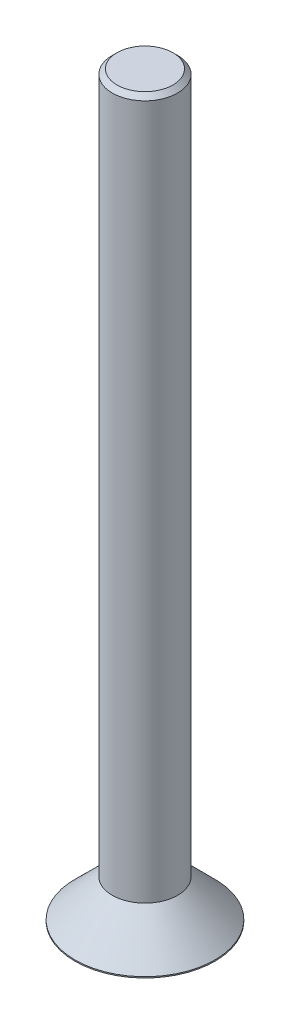
ISO-10303-21;
HEADER;
FILE_DESCRIPTION(('STEP AP214'),'2;1');
FILE_NAME('part.step','',(''),(''),'','','');
FILE_SCHEMA(('AUTOMOTIVE_DESIGN { 1 0 10303 214 1 1 1 1 }'));
ENDSEC;
DATA;
#1=APPLICATION_CONTEXT('core data for automotive mechanical design processes');
#2=APPLICATION_PROTOCOL_DEFINITION('international standard','automotive_design',2000,#1);
#3=PRODUCT_CONTEXT('',#1,'mechanical');
#4=PRODUCT('Part','Part','',(#3));
#5=PRODUCT_RELATED_PRODUCT_CATEGORY('part','',(#4));
#6=PRODUCT_DEFINITION_FORMATION('','',#4);
#7=PRODUCT_DEFINITION_CONTEXT('part definition',#1,'design');
#8=PRODUCT_DEFINITION('design','',#6,#7);
#9=PRODUCT_DEFINITION_SHAPE('','',#8);
#10=(LENGTH_UNIT() NAMED_UNIT(*) SI_UNIT(.MILLI.,.METRE.));
#11=(NAMED_UNIT(*) PLANE_ANGLE_UNIT() SI_UNIT($,.RADIAN.));
#12=(NAMED_UNIT(*) SI_UNIT($,.STERADIAN.) SOLID_ANGLE_UNIT());
#13=UNCERTAINTY_MEASURE_WITH_UNIT(LENGTH_MEASURE(1.E-05),#10,'distance_accuracy_value','');
#14=(GEOMETRIC_REPRESENTATION_CONTEXT(3) GLOBAL_UNCERTAINTY_ASSIGNED_CONTEXT((#13)) GLOBAL_UNIT_ASSIGNED_CONTEXT((#10,
#11,#12)) REPRESENTATION_CONTEXT('',''));
#15=CARTESIAN_POINT('',(0.,0.,0.));
#16=DIRECTION('',(0.,0.,1.));
#17=DIRECTION('',(1.,0.,0.));
#18=AXIS2_PLACEMENT_3D('',#15,#16,#17);
#19=CARTESIAN_POINT('',(0.,1.65,0.));
#20=DIRECTION('',(0.,-1.,0.));
#21=DIRECTION('',(0.,0.,-1.));
#22=AXIS2_PLACEMENT_3D('',#19,#20,#21);
#23=CYLINDRICAL_SURFACE('',#22,3.);
#24=CARTESIAN_POINT('',(0.,0.0499999999999921,0.));
#25=DIRECTION('',(0.,1.,0.));
#26=DIRECTION('',(0.,0.,1.));
#27=AXIS2_PLACEMENT_3D('',#24,#25,#26);
#28=CIRCLE('',#27,3.);
#29=CARTESIAN_POINT('',(0.,0.0499999999999921,3.));
#30=VERTEX_POINT('',#29);
#31=EDGE_CURVE('E151',#30,#30,#28,.F.);
#32=ORIENTED_EDGE('',*,*,#31,.T.);
#33=EDGE_LOOP('',(#32));
#34=FACE_BOUND('',#33,.T.);
#35=CARTESIAN_POINT('',(0.,0.,0.));
#36=DIRECTION('',(0.,1.,0.));
#37=DIRECTION('',(0.,0.,1.));
#38=AXIS2_PLACEMENT_3D('',#35,#36,#37);
#39=CIRCLE('',#38,3.);
#40=CARTESIAN_POINT('',(0.,0.,3.));
#41=VERTEX_POINT('',#40);
#42=EDGE_CURVE('E140',#41,#41,#39,.T.);
#43=ORIENTED_EDGE('',*,*,#42,.T.);
#44=EDGE_LOOP('',(#43));
#45=FACE_BOUND('',#44,.T.);
#46=ADVANCED_FACE('F37',(#34,#45),#23,.T.);
#47=CARTESIAN_POINT('',(0.,0.,0.));
#48=DIRECTION('',(0.,1.,0.));
#49=DIRECTION('',(0.,0.,1.));
#50=AXIS2_PLACEMENT_3D('',#47,#48,#49);
#51=PLANE('',#50);
#52=DIRECTION('',(0.,0.,1.));
#53=VECTOR('',#52,1.);
#54=CARTESIAN_POINT('',(1.,0.,-0.577350269189627));
#55=LINE('',#54,#53);
#56=CARTESIAN_POINT('',(1.,0.,-0.577350269189627));
#57=VERTEX_POINT('',#56);
#58=CARTESIAN_POINT('',(1.,0.,0.577350269189626));
#59=VERTEX_POINT('',#58);
#60=EDGE_CURVE('E127',#57,#59,#55,.T.);
#61=ORIENTED_EDGE('',*,*,#60,.F.);
#62=DIRECTION('',(0.866025403784439,0.,0.5));
#63=VECTOR('',#62,1.);
#64=CARTESIAN_POINT('',(0.,0.,-1.15470053837925));
#65=LINE('',#64,#63);
#66=CARTESIAN_POINT('',(0.,0.,-1.15470053837925));
#67=VERTEX_POINT('',#66);
#68=EDGE_CURVE('E53',#67,#57,#65,.T.);
#69=ORIENTED_EDGE('',*,*,#68,.F.);
#70=DIRECTION('',(0.866025403784439,0.,-0.5));
#71=VECTOR('',#70,1.);
#72=CARTESIAN_POINT('',(-1.,0.,-0.577350269189626));
#73=LINE('',#72,#71);
#74=CARTESIAN_POINT('',(-1.,0.,-0.577350269189626));
#75=VERTEX_POINT('',#74);
#76=EDGE_CURVE('E136',#75,#67,#73,.T.);
#77=ORIENTED_EDGE('',*,*,#76,.F.);
#78=DIRECTION('',(0.,0.,-1.));
#79=VECTOR('',#78,1.);
#80=CARTESIAN_POINT('',(-1.,0.,0.577350269189626));
#81=LINE('',#80,#79);
#82=CARTESIAN_POINT('',(-1.,0.,0.577350269189626));
#83=VERTEX_POINT('',#82);
#84=EDGE_CURVE('E134',#83,#75,#81,.T.);
#85=ORIENTED_EDGE('',*,*,#84,.F.);
#86=DIRECTION('',(-0.866025403784439,0.,-0.5));
#87=VECTOR('',#86,1.);
#88=CARTESIAN_POINT('',(0.,0.,1.15470053837925));
#89=LINE('',#88,#87);
#90=CARTESIAN_POINT('',(0.,0.,1.15470053837925));
#91=VERTEX_POINT('',#90);
#92=EDGE_CURVE('E101',#91,#83,#89,.T.);
#93=ORIENTED_EDGE('',*,*,#92,.F.);
#94=DIRECTION('',(-0.866025403784439,0.,0.5));
#95=VECTOR('',#94,1.);
#96=CARTESIAN_POINT('',(1.,0.,0.577350269189626));
#97=LINE('',#96,#95);
#98=EDGE_CURVE('E130',#59,#91,#97,.T.);
#99=ORIENTED_EDGE('',*,*,#98,.F.);
#100=EDGE_LOOP('',(#61,#69,#77,#85,#93,#99));
#101=FACE_BOUND('',#100,.T.);
#102=ORIENTED_EDGE('',*,*,#42,.F.);
#103=EDGE_LOOP('',(#102));
#104=FACE_BOUND('',#103,.T.);
#105=ADVANCED_FACE('F167',(#101,#104),#51,.F.);
#106=CARTESIAN_POINT('',(0.,1.65,0.));
#107=DIRECTION('',(0.,-1.,0.));
#108=DIRECTION('',(0.,0.,-1.));
#109=AXIS2_PLACEMENT_3D('',#106,#107,#108);
#110=CONICAL_SURFACE('',#109,1.4,0.785398163397447);
#111=ORIENTED_EDGE('',*,*,#31,.F.);
#112=EDGE_LOOP('',(#111));
#113=FACE_BOUND('',#112,.T.);
#114=CARTESIAN_POINT('',(0.,1.65,0.));
#115=DIRECTION('',(0.,1.,0.));
#116=DIRECTION('',(0.,0.,1.));
#117=AXIS2_PLACEMENT_3D('',#114,#115,#116);
#118=CIRCLE('',#117,1.4);
#119=CARTESIAN_POINT('',(0.,1.65,1.4));
#120=VERTEX_POINT('',#119);
#121=EDGE_CURVE('E148',#120,#120,#118,.T.);
#122=ORIENTED_EDGE('',*,*,#121,.F.);
#123=EDGE_LOOP('',(#122));
#124=FACE_BOUND('',#123,.T.);
#125=ADVANCED_FACE('F173',(#113,#124),#110,.T.);
#126=CARTESIAN_POINT('',(0.,0.95,-1.15470053837925));
#127=DIRECTION('',(0.5,0.,-0.866025403784439));
#128=DIRECTION('',(-0.866025403784439,0.,-0.5));
#129=AXIS2_PLACEMENT_3D('',#126,#127,#128);
#130=PLANE('',#129);
#131=ORIENTED_EDGE('',*,*,#68,.T.);
#132=DIRECTION('',(0.,-1.,0.));
#133=VECTOR('',#132,1.);
#134=CARTESIAN_POINT('',(1.,0.95,-0.577350269189627));
#135=LINE('',#134,#133);
#136=CARTESIAN_POINT('',(1.,0.95,-0.577350269189627));
#137=VERTEX_POINT('',#136);
#138=EDGE_CURVE('E83',#137,#57,#135,.T.);
#139=ORIENTED_EDGE('',*,*,#138,.F.);
#140=DIRECTION('',(0.866025403784439,0.,0.5));
#141=VECTOR('',#140,1.);
#142=CARTESIAN_POINT('',(0.,0.95,-1.15470053837925));
#143=LINE('',#142,#141);
#144=CARTESIAN_POINT('',(0.,0.95,-1.15470053837925));
#145=VERTEX_POINT('',#144);
#146=EDGE_CURVE('E138',#145,#137,#143,.T.);
#147=ORIENTED_EDGE('',*,*,#146,.F.);
#148=DIRECTION('',(0.,-1.,0.));
#149=VECTOR('',#148,1.);
#150=CARTESIAN_POINT('',(0.,0.95,-1.15470053837925));
#151=LINE('',#150,#149);
#152=EDGE_CURVE('E61',#145,#67,#151,.T.);
#153=ORIENTED_EDGE('',*,*,#152,.T.);
#154=EDGE_LOOP('',(#131,#139,#147,#153));
#155=FACE_BOUND('',#154,.T.);
#156=ADVANCED_FACE('F182',(#155),#130,.F.);
#157=CARTESIAN_POINT('',(-1.,0.95,-0.577350269189626));
#158=DIRECTION('',(-0.5,0.,-0.866025403784439));
#159=DIRECTION('',(-0.866025403784439,0.,0.5));
#160=AXIS2_PLACEMENT_3D('',#157,#158,#159);
#161=PLANE('',#160);
#162=ORIENTED_EDGE('',*,*,#76,.T.);
#163=ORIENTED_EDGE('',*,*,#152,.F.);
#164=DIRECTION('',(0.866025403784439,0.,-0.5));
#165=VECTOR('',#164,1.);
#166=CARTESIAN_POINT('',(-1.,0.95,-0.577350269189626));
#167=LINE('',#166,#165);
#168=CARTESIAN_POINT('',(-1.,0.95,-0.577350269189626));
#169=VERTEX_POINT('',#168);
#170=EDGE_CURVE('E113',#169,#145,#167,.T.);
#171=ORIENTED_EDGE('',*,*,#170,.F.);
#172=DIRECTION('',(0.,-1.,0.));
#173=VECTOR('',#172,1.);
#174=CARTESIAN_POINT('',(-1.,0.95,-0.577350269189626));
#175=LINE('',#174,#173);
#176=EDGE_CURVE('E105',#169,#75,#175,.T.);
#177=ORIENTED_EDGE('',*,*,#176,.T.);
#178=EDGE_LOOP('',(#162,#163,#171,#177));
#179=FACE_BOUND('',#178,.T.);
#180=ADVANCED_FACE('F187',(#179),#161,.F.);
#181=CARTESIAN_POINT('',(-1.,0.95,0.577350269189626));
#182=DIRECTION('',(-1.,0.,0.));
#183=DIRECTION('',(0.,0.,1.));
#184=AXIS2_PLACEMENT_3D('',#181,#182,#183);
#185=PLANE('',#184);
#186=ORIENTED_EDGE('',*,*,#84,.T.);
#187=ORIENTED_EDGE('',*,*,#176,.F.);
#188=DIRECTION('',(0.,0.,-1.));
#189=VECTOR('',#188,1.);
#190=CARTESIAN_POINT('',(-1.,0.95,0.577350269189626));
#191=LINE('',#190,#189);
#192=CARTESIAN_POINT('',(-1.,0.95,0.577350269189626));
#193=VERTEX_POINT('',#192);
#194=EDGE_CURVE('E109',#193,#169,#191,.T.);
#195=ORIENTED_EDGE('',*,*,#194,.F.);
#196=DIRECTION('',(0.,-1.,0.));
#197=VECTOR('',#196,1.);
#198=CARTESIAN_POINT('',(-1.,0.95,0.577350269189626));
#199=LINE('',#198,#197);
#200=EDGE_CURVE('E94',#193,#83,#199,.T.);
#201=ORIENTED_EDGE('',*,*,#200,.T.);
#202=EDGE_LOOP('',(#186,#187,#195,#201));
#203=FACE_BOUND('',#202,.T.);
#204=ADVANCED_FACE('F110',(#203),#185,.F.);
#205=CARTESIAN_POINT('',(0.,0.95,1.15470053837925));
#206=DIRECTION('',(-0.5,0.,0.866025403784439));
#207=DIRECTION('',(0.866025403784439,0.,0.5));
#208=AXIS2_PLACEMENT_3D('',#205,#206,#207);
#209=PLANE('',#208);
#210=ORIENTED_EDGE('',*,*,#92,.T.);
#211=ORIENTED_EDGE('',*,*,#200,.F.);
#212=DIRECTION('',(-0.866025403784439,0.,-0.5));
#213=VECTOR('',#212,1.);
#214=CARTESIAN_POINT('',(0.,0.95,1.15470053837925));
#215=LINE('',#214,#213);
#216=CARTESIAN_POINT('',(0.,0.95,1.15470053837925));
#217=VERTEX_POINT('',#216);
#218=EDGE_CURVE('E98',#217,#193,#215,.T.);
#219=ORIENTED_EDGE('',*,*,#218,.F.);
#220=DIRECTION('',(0.,-1.,0.));
#221=VECTOR('',#220,1.);
#222=CARTESIAN_POINT('',(0.,0.95,1.15470053837925));
#223=LINE('',#222,#221);
#224=EDGE_CURVE('E106',#217,#91,#223,.T.);
#225=ORIENTED_EDGE('',*,*,#224,.T.);
#226=EDGE_LOOP('',(#210,#211,#219,#225));
#227=FACE_BOUND('',#226,.T.);
#228=ADVANCED_FACE('F96',(#227),#209,.F.);
#229=CARTESIAN_POINT('',(1.,0.95,0.577350269189626));
#230=DIRECTION('',(0.5,0.,0.866025403784439));
#231=DIRECTION('',(0.866025403784439,0.,-0.5));
#232=AXIS2_PLACEMENT_3D('',#229,#230,#231);
#233=PLANE('',#232);
#234=ORIENTED_EDGE('',*,*,#98,.T.);
#235=ORIENTED_EDGE('',*,*,#224,.F.);
#236=DIRECTION('',(-0.866025403784439,0.,0.5));
#237=VECTOR('',#236,1.);
#238=CARTESIAN_POINT('',(1.,0.95,0.577350269189626));
#239=LINE('',#238,#237);
#240=CARTESIAN_POINT('',(1.,0.95,0.577350269189626));
#241=VERTEX_POINT('',#240);
#242=EDGE_CURVE('E119',#241,#217,#239,.T.);
#243=ORIENTED_EDGE('',*,*,#242,.F.);
#244=DIRECTION('',(0.,-1.,0.));
#245=VECTOR('',#244,1.);
#246=CARTESIAN_POINT('',(1.,0.95,0.577350269189626));
#247=LINE('',#246,#245);
#248=EDGE_CURVE('E143',#241,#59,#247,.T.);
#249=ORIENTED_EDGE('',*,*,#248,.T.);
#250=EDGE_LOOP('',(#234,#235,#243,#249));
#251=FACE_BOUND('',#250,.T.);
#252=ADVANCED_FACE('F207',(#251),#233,.F.);
#253=CARTESIAN_POINT('',(1.,0.95,-0.577350269189627));
#254=DIRECTION('',(1.,0.,0.));
#255=DIRECTION('',(0.,0.,-1.));
#256=AXIS2_PLACEMENT_3D('',#253,#254,#255);
#257=PLANE('',#256);
#258=ORIENTED_EDGE('',*,*,#60,.T.);
#259=ORIENTED_EDGE('',*,*,#248,.F.);
#260=DIRECTION('',(0.,0.,1.));
#261=VECTOR('',#260,1.);
#262=CARTESIAN_POINT('',(1.,0.95,-0.577350269189627));
#263=LINE('',#262,#261);
#264=EDGE_CURVE('E121',#137,#241,#263,.T.);
#265=ORIENTED_EDGE('',*,*,#264,.F.);
#266=ORIENTED_EDGE('',*,*,#138,.T.);
#267=EDGE_LOOP('',(#258,#259,#265,#266));
#268=FACE_BOUND('',#267,.T.);
#269=ADVANCED_FACE('F198',(#268),#257,.F.);
#270=CARTESIAN_POINT('',(0.,0.95,0.));
#271=DIRECTION('',(0.,-1.,0.));
#272=DIRECTION('',(0.,0.,-1.));
#273=AXIS2_PLACEMENT_3D('',#270,#271,#272);
#274=PLANE('',#273);
#275=ORIENTED_EDGE('',*,*,#146,.T.);
#276=ORIENTED_EDGE('',*,*,#264,.T.);
#277=ORIENTED_EDGE('',*,*,#242,.T.);
#278=ORIENTED_EDGE('',*,*,#218,.T.);
#279=ORIENTED_EDGE('',*,*,#194,.T.);
#280=ORIENTED_EDGE('',*,*,#170,.T.);
#281=EDGE_LOOP('',(#275,#276,#277,#278,#279,#280));
#282=FACE_BOUND('',#281,.T.);
#283=ADVANCED_FACE('F116',(#282),#274,.T.);
#284=CARTESIAN_POINT('',(0.,31.65,0.));
#285=DIRECTION('',(0.,-1.,0.));
#286=DIRECTION('',(0.,0.,-1.));
#287=AXIS2_PLACEMENT_3D('',#284,#285,#286);
#288=CYLINDRICAL_SURFACE('',#287,1.4);
#289=CARTESIAN_POINT('',(0.,31.45,0.));
#290=DIRECTION('',(0.,1.,0.));
#291=DIRECTION('',(0.,0.,1.));
#292=AXIS2_PLACEMENT_3D('',#289,#290,#291);
#293=CIRCLE('',#292,1.4);
#294=CARTESIAN_POINT('',(0.,31.45,1.4));
#295=VERTEX_POINT('',#294);
#296=EDGE_CURVE('E11',#295,#295,#293,.F.);
#297=ORIENTED_EDGE('',*,*,#296,.T.);
#298=EDGE_LOOP('',(#297));
#299=FACE_BOUND('',#298,.T.);
#300=ORIENTED_EDGE('',*,*,#121,.T.);
#301=EDGE_LOOP('',(#300));
#302=FACE_BOUND('',#301,.T.);
#303=ADVANCED_FACE('F163',(#299,#302),#288,.T.);
#304=CARTESIAN_POINT('',(0.,31.65,0.));
#305=DIRECTION('',(0.,1.,0.));
#306=DIRECTION('',(0.,0.,1.));
#307=AXIS2_PLACEMENT_3D('',#304,#305,#306);
#308=PLANE('',#307);
#309=CARTESIAN_POINT('',(0.,31.65,0.));
#310=DIRECTION('',(0.,1.,0.));
#311=DIRECTION('',(0.,0.,1.));
#312=AXIS2_PLACEMENT_3D('',#309,#310,#311);
#313=CIRCLE('',#312,1.2);
#314=CARTESIAN_POINT('',(0.,31.65,1.2));
#315=VERTEX_POINT('',#314);
#316=EDGE_CURVE('E46',#315,#315,#313,.T.);
#317=ORIENTED_EDGE('',*,*,#316,.T.);
#318=EDGE_LOOP('',(#317));
#319=FACE_BOUND('',#318,.T.);
#320=ADVANCED_FACE('F156',(#319),#308,.T.);
#321=CARTESIAN_POINT('',(0.,31.65,0.));
#322=DIRECTION('',(0.,-1.,0.));
#323=DIRECTION('',(0.,0.,-1.));
#324=AXIS2_PLACEMENT_3D('',#321,#322,#323);
#325=CONICAL_SURFACE('',#324,1.2,0.785398163397453);
#326=ORIENTED_EDGE('',*,*,#296,.F.);
#327=EDGE_LOOP('',(#326));
#328=FACE_BOUND('',#327,.T.);
#329=ORIENTED_EDGE('',*,*,#316,.F.);
#330=EDGE_LOOP('',(#329));
#331=FACE_BOUND('',#330,.T.);
#332=ADVANCED_FACE('F40',(#328,#331),#325,.T.);
#333=CLOSED_SHELL('',(#46,#105,#125,#156,#180,#204,#228,#252,#269,#283,#303,#320,#332));
#334=MANIFOLD_SOLID_BREP('B2',#333);
#335=ADVANCED_BREP_SHAPE_REPRESENTATION('',(#18,#334),#14);
#336=SHAPE_DEFINITION_REPRESENTATION(#9,#335);
ENDSEC;
END-ISO-10303-21;
